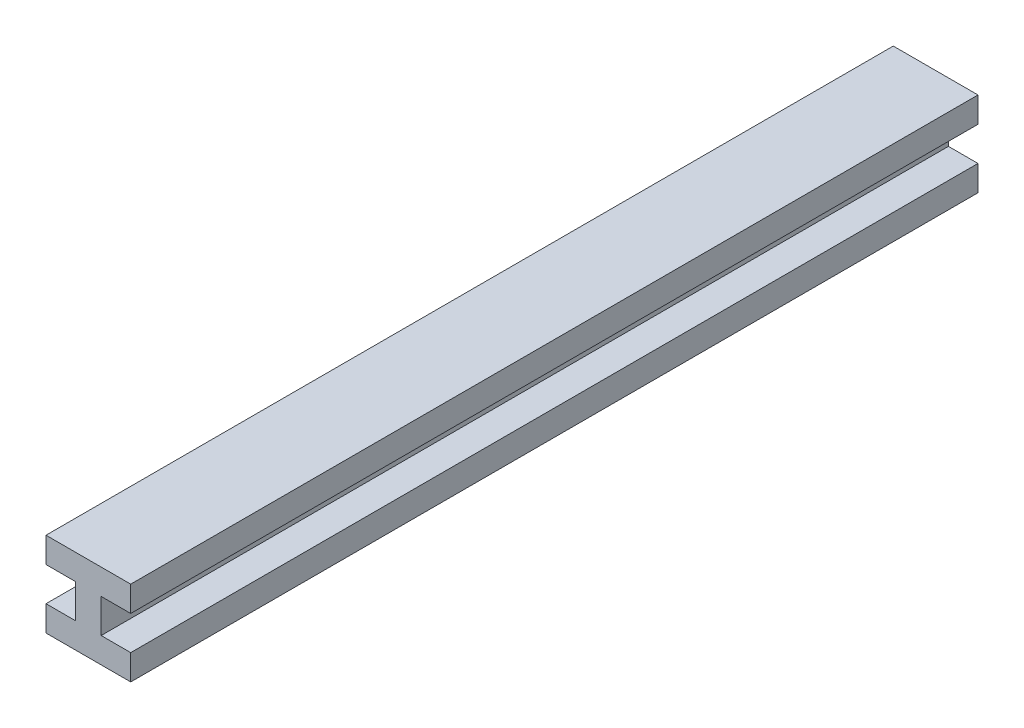
ISO-10303-21;
HEADER;
FILE_DESCRIPTION(('STEP AP214'),'2;1');
FILE_NAME('part.step','',(''),(''),'','','');
FILE_SCHEMA(('AUTOMOTIVE_DESIGN { 1 0 10303 214 1 1 1 1 }'));
ENDSEC;
DATA;
#1=APPLICATION_CONTEXT('core data for automotive mechanical design processes');
#2=APPLICATION_PROTOCOL_DEFINITION('international standard','automotive_design',2000,#1);
#3=PRODUCT_CONTEXT('',#1,'mechanical');
#4=PRODUCT('Part','Part','',(#3));
#5=PRODUCT_RELATED_PRODUCT_CATEGORY('part','',(#4));
#6=PRODUCT_DEFINITION_FORMATION('','',#4);
#7=PRODUCT_DEFINITION_CONTEXT('part definition',#1,'design');
#8=PRODUCT_DEFINITION('design','',#6,#7);
#9=PRODUCT_DEFINITION_SHAPE('','',#8);
#10=(LENGTH_UNIT() NAMED_UNIT(*) SI_UNIT(.MILLI.,.METRE.));
#11=(NAMED_UNIT(*) PLANE_ANGLE_UNIT() SI_UNIT($,.RADIAN.));
#12=(NAMED_UNIT(*) SI_UNIT($,.STERADIAN.) SOLID_ANGLE_UNIT());
#13=UNCERTAINTY_MEASURE_WITH_UNIT(LENGTH_MEASURE(1.E-05),#10,'distance_accuracy_value','');
#14=(GEOMETRIC_REPRESENTATION_CONTEXT(3) GLOBAL_UNCERTAINTY_ASSIGNED_CONTEXT((#13)) GLOBAL_UNIT_ASSIGNED_CONTEXT((#10,
#11,#12)) REPRESENTATION_CONTEXT('',''));
#15=CARTESIAN_POINT('',(0.,0.,0.));
#16=DIRECTION('',(0.,0.,1.));
#17=DIRECTION('',(1.,0.,0.));
#18=AXIS2_PLACEMENT_3D('',#15,#16,#17);
#19=CARTESIAN_POINT('',(-5.,0.,100.));
#20=DIRECTION('',(1.,0.,0.));
#21=DIRECTION('',(0.,0.,-1.));
#22=AXIS2_PLACEMENT_3D('',#19,#20,#21);
#23=PLANE('',#22);
#24=DIRECTION('',(0.,-1.,0.));
#25=VECTOR('',#24,1.);
#26=CARTESIAN_POINT('',(-5.,0.,0.));
#27=LINE('',#26,#25);
#28=CARTESIAN_POINT('',(-5.,3.,0.));
#29=VERTEX_POINT('',#28);
#30=CARTESIAN_POINT('',(-5.,0.,0.));
#31=VERTEX_POINT('',#30);
#32=EDGE_CURVE('E154',#29,#31,#27,.T.);
#33=ORIENTED_EDGE('',*,*,#32,.T.);
#34=DIRECTION('',(0.,0.,-1.));
#35=VECTOR('',#34,1.);
#36=CARTESIAN_POINT('',(-5.,0.,100.));
#37=LINE('',#36,#35);
#38=CARTESIAN_POINT('',(-5.,0.,100.));
#39=VERTEX_POINT('',#38);
#40=EDGE_CURVE('E11',#39,#31,#37,.T.);
#41=ORIENTED_EDGE('',*,*,#40,.F.);
#42=DIRECTION('',(0.,-1.,0.));
#43=VECTOR('',#42,1.);
#44=CARTESIAN_POINT('',(-5.,0.,100.));
#45=LINE('',#44,#43);
#46=CARTESIAN_POINT('',(-5.,3.,100.));
#47=VERTEX_POINT('',#46);
#48=EDGE_CURVE('E176',#47,#39,#45,.T.);
#49=ORIENTED_EDGE('',*,*,#48,.F.);
#50=DIRECTION('',(0.,0.,-1.));
#51=VECTOR('',#50,1.);
#52=CARTESIAN_POINT('',(-5.,3.,100.));
#53=LINE('',#52,#51);
#54=EDGE_CURVE('E150',#47,#29,#53,.T.);
#55=ORIENTED_EDGE('',*,*,#54,.T.);
#56=EDGE_LOOP('',(#33,#41,#49,#55));
#57=FACE_BOUND('',#56,.T.);
#58=ADVANCED_FACE('F34',(#57),#23,.F.);
#59=CARTESIAN_POINT('',(5.,0.,100.));
#60=DIRECTION('',(0.,1.,0.));
#61=DIRECTION('',(-1.,0.,0.));
#62=AXIS2_PLACEMENT_3D('',#59,#60,#61);
#63=PLANE('',#62);
#64=DIRECTION('',(1.,0.,0.));
#65=VECTOR('',#64,1.);
#66=CARTESIAN_POINT('',(5.,0.,0.));
#67=LINE('',#66,#65);
#68=CARTESIAN_POINT('',(5.,0.,0.));
#69=VERTEX_POINT('',#68);
#70=EDGE_CURVE('E157',#31,#69,#67,.T.);
#71=ORIENTED_EDGE('',*,*,#70,.T.);
#72=DIRECTION('',(0.,0.,-1.));
#73=VECTOR('',#72,1.);
#74=CARTESIAN_POINT('',(5.,0.,100.));
#75=LINE('',#74,#73);
#76=CARTESIAN_POINT('',(5.,0.,100.));
#77=VERTEX_POINT('',#76);
#78=EDGE_CURVE('E42',#77,#69,#75,.T.);
#79=ORIENTED_EDGE('',*,*,#78,.F.);
#80=DIRECTION('',(1.,0.,0.));
#81=VECTOR('',#80,1.);
#82=CARTESIAN_POINT('',(5.,0.,100.));
#83=LINE('',#82,#81);
#84=EDGE_CURVE('E105',#39,#77,#83,.T.);
#85=ORIENTED_EDGE('',*,*,#84,.F.);
#86=ORIENTED_EDGE('',*,*,#40,.T.);
#87=EDGE_LOOP('',(#71,#79,#85,#86));
#88=FACE_BOUND('',#87,.T.);
#89=ADVANCED_FACE('F254',(#88),#63,.F.);
#90=CARTESIAN_POINT('',(5.,0.,100.));
#91=DIRECTION('',(-1.,0.,0.));
#92=DIRECTION('',(0.,-1.,0.));
#93=AXIS2_PLACEMENT_3D('',#90,#91,#92);
#94=PLANE('',#93);
#95=DIRECTION('',(0.,1.,0.));
#96=VECTOR('',#95,1.);
#97=CARTESIAN_POINT('',(5.,0.,0.));
#98=LINE('',#97,#96);
#99=CARTESIAN_POINT('',(4.99999999999998,3.00000000000003,0.));
#100=VERTEX_POINT('',#99);
#101=EDGE_CURVE('E159',#69,#100,#98,.T.);
#102=ORIENTED_EDGE('',*,*,#101,.T.);
#103=DIRECTION('',(0.,0.,-1.));
#104=VECTOR('',#103,1.);
#105=CARTESIAN_POINT('',(4.99999999999998,3.00000000000003,100.));
#106=LINE('',#105,#104);
#107=CARTESIAN_POINT('',(4.99999999999998,3.00000000000003,100.));
#108=VERTEX_POINT('',#107);
#109=EDGE_CURVE('E195',#108,#100,#106,.T.);
#110=ORIENTED_EDGE('',*,*,#109,.F.);
#111=DIRECTION('',(0.,1.,0.));
#112=VECTOR('',#111,1.);
#113=CARTESIAN_POINT('',(5.,0.,100.));
#114=LINE('',#113,#112);
#115=EDGE_CURVE('E203',#77,#108,#114,.T.);
#116=ORIENTED_EDGE('',*,*,#115,.F.);
#117=ORIENTED_EDGE('',*,*,#78,.T.);
#118=EDGE_LOOP('',(#102,#110,#116,#117));
#119=FACE_BOUND('',#118,.T.);
#120=ADVANCED_FACE('F201',(#119),#94,.F.);
#121=CARTESIAN_POINT('',(4.99999999999998,3.00000000000003,100.));
#122=DIRECTION('',(0.,-1.,0.));
#123=DIRECTION('',(1.,0.,0.));
#124=AXIS2_PLACEMENT_3D('',#121,#122,#123);
#125=PLANE('',#124);
#126=DIRECTION('',(-1.,0.,0.));
#127=VECTOR('',#126,1.);
#128=CARTESIAN_POINT('',(4.99999999999998,3.00000000000003,0.));
#129=LINE('',#128,#127);
#130=CARTESIAN_POINT('',(1.51079136690661,3.,0.));
#131=VERTEX_POINT('',#130);
#132=EDGE_CURVE('E161',#100,#131,#129,.T.);
#133=ORIENTED_EDGE('',*,*,#132,.T.);
#134=DIRECTION('',(0.,0.,-1.));
#135=VECTOR('',#134,1.);
#136=CARTESIAN_POINT('',(1.51079136690661,3.,100.));
#137=LINE('',#136,#135);
#138=CARTESIAN_POINT('',(1.51079136690661,3.,100.));
#139=VERTEX_POINT('',#138);
#140=EDGE_CURVE('E192',#139,#131,#137,.T.);
#141=ORIENTED_EDGE('',*,*,#140,.F.);
#142=DIRECTION('',(-1.,0.,0.));
#143=VECTOR('',#142,1.);
#144=CARTESIAN_POINT('',(4.99999999999998,3.00000000000003,100.));
#145=LINE('',#144,#143);
#146=EDGE_CURVE('E221',#108,#139,#145,.T.);
#147=ORIENTED_EDGE('',*,*,#146,.F.);
#148=ORIENTED_EDGE('',*,*,#109,.T.);
#149=EDGE_LOOP('',(#133,#141,#147,#148));
#150=FACE_BOUND('',#149,.T.);
#151=ADVANCED_FACE('F212',(#150),#125,.F.);
#152=CARTESIAN_POINT('',(1.51079136690661,3.,100.));
#153=DIRECTION('',(-1.,0.,0.));
#154=DIRECTION('',(0.,-1.,0.));
#155=AXIS2_PLACEMENT_3D('',#152,#153,#154);
#156=PLANE('',#155);
#157=DIRECTION('',(0.,1.,0.));
#158=VECTOR('',#157,1.);
#159=CARTESIAN_POINT('',(1.51079136690661,3.,0.));
#160=LINE('',#159,#158);
#161=CARTESIAN_POINT('',(1.51079136690658,7.,0.));
#162=VERTEX_POINT('',#161);
#163=EDGE_CURVE('E163',#131,#162,#160,.T.);
#164=ORIENTED_EDGE('',*,*,#163,.T.);
#165=DIRECTION('',(0.,0.,-1.));
#166=VECTOR('',#165,1.);
#167=CARTESIAN_POINT('',(1.51079136690658,7.,100.));
#168=LINE('',#167,#166);
#169=CARTESIAN_POINT('',(1.51079136690658,7.,100.));
#170=VERTEX_POINT('',#169);
#171=EDGE_CURVE('E189',#170,#162,#168,.T.);
#172=ORIENTED_EDGE('',*,*,#171,.F.);
#173=DIRECTION('',(0.,1.,0.));
#174=VECTOR('',#173,1.);
#175=CARTESIAN_POINT('',(1.51079136690661,3.,100.));
#176=LINE('',#175,#174);
#177=EDGE_CURVE('E218',#139,#170,#176,.T.);
#178=ORIENTED_EDGE('',*,*,#177,.F.);
#179=ORIENTED_EDGE('',*,*,#140,.T.);
#180=EDGE_LOOP('',(#164,#172,#178,#179));
#181=FACE_BOUND('',#180,.T.);
#182=ADVANCED_FACE('F216',(#181),#156,.F.);
#183=CARTESIAN_POINT('',(1.51079136690658,7.,100.));
#184=DIRECTION('',(0.,1.,0.));
#185=DIRECTION('',(-1.,0.,0.));
#186=AXIS2_PLACEMENT_3D('',#183,#184,#185);
#187=PLANE('',#186);
#188=DIRECTION('',(1.,0.,0.));
#189=VECTOR('',#188,1.);
#190=CARTESIAN_POINT('',(1.51079136690658,7.,0.));
#191=LINE('',#190,#189);
#192=CARTESIAN_POINT('',(4.99999999999995,7.00000000000006,0.));
#193=VERTEX_POINT('',#192);
#194=EDGE_CURVE('E165',#162,#193,#191,.T.);
#195=ORIENTED_EDGE('',*,*,#194,.T.);
#196=DIRECTION('',(0.,0.,-1.));
#197=VECTOR('',#196,1.);
#198=CARTESIAN_POINT('',(4.99999999999995,7.00000000000006,100.));
#199=LINE('',#198,#197);
#200=CARTESIAN_POINT('',(4.99999999999995,7.00000000000006,100.));
#201=VERTEX_POINT('',#200);
#202=EDGE_CURVE('E186',#201,#193,#199,.T.);
#203=ORIENTED_EDGE('',*,*,#202,.F.);
#204=DIRECTION('',(1.,0.,0.));
#205=VECTOR('',#204,1.);
#206=CARTESIAN_POINT('',(1.51079136690658,7.,100.));
#207=LINE('',#206,#205);
#208=EDGE_CURVE('E220',#170,#201,#207,.T.);
#209=ORIENTED_EDGE('',*,*,#208,.F.);
#210=ORIENTED_EDGE('',*,*,#171,.T.);
#211=EDGE_LOOP('',(#195,#203,#209,#210));
#212=FACE_BOUND('',#211,.T.);
#213=ADVANCED_FACE('F267',(#212),#187,.F.);
#214=CARTESIAN_POINT('',(4.99999999999995,7.00000000000006,100.));
#215=DIRECTION('',(-1.,0.,0.));
#216=DIRECTION('',(0.,-1.,0.));
#217=AXIS2_PLACEMENT_3D('',#214,#215,#216);
#218=PLANE('',#217);
#219=DIRECTION('',(0.,1.,0.));
#220=VECTOR('',#219,1.);
#221=CARTESIAN_POINT('',(4.99999999999995,7.00000000000006,0.));
#222=LINE('',#221,#220);
#223=CARTESIAN_POINT('',(4.99999999999993,10.0000000000001,0.));
#224=VERTEX_POINT('',#223);
#225=EDGE_CURVE('E167',#193,#224,#222,.T.);
#226=ORIENTED_EDGE('',*,*,#225,.T.);
#227=DIRECTION('',(0.,0.,-1.));
#228=VECTOR('',#227,1.);
#229=CARTESIAN_POINT('',(4.99999999999993,10.0000000000001,100.));
#230=LINE('',#229,#228);
#231=CARTESIAN_POINT('',(4.99999999999993,10.0000000000001,100.));
#232=VERTEX_POINT('',#231);
#233=EDGE_CURVE('E183',#232,#224,#230,.T.);
#234=ORIENTED_EDGE('',*,*,#233,.F.);
#235=DIRECTION('',(0.,1.,0.));
#236=VECTOR('',#235,1.);
#237=CARTESIAN_POINT('',(4.99999999999995,7.00000000000006,100.));
#238=LINE('',#237,#236);
#239=EDGE_CURVE('E223',#201,#232,#238,.T.);
#240=ORIENTED_EDGE('',*,*,#239,.F.);
#241=ORIENTED_EDGE('',*,*,#202,.T.);
#242=EDGE_LOOP('',(#226,#234,#240,#241));
#243=FACE_BOUND('',#242,.T.);
#244=ADVANCED_FACE('F270',(#243),#218,.F.);
#245=CARTESIAN_POINT('',(-5.,10.,100.));
#246=DIRECTION('',(0.,-1.,0.));
#247=DIRECTION('',(1.,0.,0.));
#248=AXIS2_PLACEMENT_3D('',#245,#246,#247);
#249=PLANE('',#248);
#250=DIRECTION('',(-1.,0.,0.));
#251=VECTOR('',#250,1.);
#252=CARTESIAN_POINT('',(-5.,10.,0.));
#253=LINE('',#252,#251);
#254=CARTESIAN_POINT('',(-5.,10.,0.));
#255=VERTEX_POINT('',#254);
#256=EDGE_CURVE('E169',#224,#255,#253,.T.);
#257=ORIENTED_EDGE('',*,*,#256,.T.);
#258=DIRECTION('',(0.,0.,-1.));
#259=VECTOR('',#258,1.);
#260=CARTESIAN_POINT('',(-5.,10.,100.));
#261=LINE('',#260,#259);
#262=CARTESIAN_POINT('',(-5.,10.,100.));
#263=VERTEX_POINT('',#262);
#264=EDGE_CURVE('E180',#263,#255,#261,.T.);
#265=ORIENTED_EDGE('',*,*,#264,.F.);
#266=DIRECTION('',(-1.,0.,0.));
#267=VECTOR('',#266,1.);
#268=CARTESIAN_POINT('',(-5.,10.,100.));
#269=LINE('',#268,#267);
#270=EDGE_CURVE('E229',#232,#263,#269,.T.);
#271=ORIENTED_EDGE('',*,*,#270,.F.);
#272=ORIENTED_EDGE('',*,*,#233,.T.);
#273=EDGE_LOOP('',(#257,#265,#271,#272));
#274=FACE_BOUND('',#273,.T.);
#275=ADVANCED_FACE('F235',(#274),#249,.F.);
#276=CARTESIAN_POINT('',(-5.,7.,100.));
#277=DIRECTION('',(1.,0.,0.));
#278=DIRECTION('',(0.,0.,-1.));
#279=AXIS2_PLACEMENT_3D('',#276,#277,#278);
#280=PLANE('',#279);
#281=DIRECTION('',(0.,-1.,0.));
#282=VECTOR('',#281,1.);
#283=CARTESIAN_POINT('',(-5.,7.,0.));
#284=LINE('',#283,#282);
#285=CARTESIAN_POINT('',(-5.,7.,0.));
#286=VERTEX_POINT('',#285);
#287=EDGE_CURVE('E171',#255,#286,#284,.T.);
#288=ORIENTED_EDGE('',*,*,#287,.T.);
#289=DIRECTION('',(0.,0.,-1.));
#290=VECTOR('',#289,1.);
#291=CARTESIAN_POINT('',(-5.,7.,100.));
#292=LINE('',#291,#290);
#293=CARTESIAN_POINT('',(-5.,7.,100.));
#294=VERTEX_POINT('',#293);
#295=EDGE_CURVE('E145',#294,#286,#292,.T.);
#296=ORIENTED_EDGE('',*,*,#295,.F.);
#297=DIRECTION('',(0.,-1.,0.));
#298=VECTOR('',#297,1.);
#299=CARTESIAN_POINT('',(-5.,7.,100.));
#300=LINE('',#299,#298);
#301=EDGE_CURVE('E136',#263,#294,#300,.T.);
#302=ORIENTED_EDGE('',*,*,#301,.F.);
#303=ORIENTED_EDGE('',*,*,#264,.T.);
#304=EDGE_LOOP('',(#288,#296,#302,#303));
#305=FACE_BOUND('',#304,.T.);
#306=ADVANCED_FACE('F239',(#305),#280,.F.);
#307=CARTESIAN_POINT('',(-1.51079136690663,7.,100.));
#308=DIRECTION('',(0.,1.,0.));
#309=DIRECTION('',(-1.,0.,0.));
#310=AXIS2_PLACEMENT_3D('',#307,#308,#309);
#311=PLANE('',#310);
#312=DIRECTION('',(1.,0.,0.));
#313=VECTOR('',#312,1.);
#314=CARTESIAN_POINT('',(-1.51079136690663,7.,0.));
#315=LINE('',#314,#313);
#316=CARTESIAN_POINT('',(-1.51079136690663,7.,0.));
#317=VERTEX_POINT('',#316);
#318=EDGE_CURVE('E144',#286,#317,#315,.T.);
#319=ORIENTED_EDGE('',*,*,#318,.T.);
#320=DIRECTION('',(0.,0.,-1.));
#321=VECTOR('',#320,1.);
#322=CARTESIAN_POINT('',(-1.51079136690663,7.,100.));
#323=LINE('',#322,#321);
#324=CARTESIAN_POINT('',(-1.51079136690663,7.,100.));
#325=VERTEX_POINT('',#324);
#326=EDGE_CURVE('E141',#325,#317,#323,.T.);
#327=ORIENTED_EDGE('',*,*,#326,.F.);
#328=DIRECTION('',(1.,0.,0.));
#329=VECTOR('',#328,1.);
#330=CARTESIAN_POINT('',(-1.51079136690663,7.,100.));
#331=LINE('',#330,#329);
#332=EDGE_CURVE('E130',#294,#325,#331,.T.);
#333=ORIENTED_EDGE('',*,*,#332,.F.);
#334=ORIENTED_EDGE('',*,*,#295,.T.);
#335=EDGE_LOOP('',(#319,#327,#333,#334));
#336=FACE_BOUND('',#335,.T.);
#337=ADVANCED_FACE('F142',(#336),#311,.F.);
#338=CARTESIAN_POINT('',(-1.51079136690663,3.,100.));
#339=DIRECTION('',(1.,0.,0.));
#340=DIRECTION('',(0.,0.,-1.));
#341=AXIS2_PLACEMENT_3D('',#338,#339,#340);
#342=PLANE('',#341);
#343=DIRECTION('',(0.,-1.,0.));
#344=VECTOR('',#343,1.);
#345=CARTESIAN_POINT('',(-1.51079136690663,3.,0.));
#346=LINE('',#345,#344);
#347=CARTESIAN_POINT('',(-1.51079136690663,3.,0.));
#348=VERTEX_POINT('',#347);
#349=EDGE_CURVE('E91',#317,#348,#346,.T.);
#350=ORIENTED_EDGE('',*,*,#349,.T.);
#351=DIRECTION('',(0.,0.,-1.));
#352=VECTOR('',#351,1.);
#353=CARTESIAN_POINT('',(-1.51079136690663,3.,100.));
#354=LINE('',#353,#352);
#355=CARTESIAN_POINT('',(-1.51079136690663,3.,100.));
#356=VERTEX_POINT('',#355);
#357=EDGE_CURVE('E146',#356,#348,#354,.T.);
#358=ORIENTED_EDGE('',*,*,#357,.F.);
#359=DIRECTION('',(0.,-1.,0.));
#360=VECTOR('',#359,1.);
#361=CARTESIAN_POINT('',(-1.51079136690663,3.,100.));
#362=LINE('',#361,#360);
#363=EDGE_CURVE('E134',#325,#356,#362,.T.);
#364=ORIENTED_EDGE('',*,*,#363,.F.);
#365=ORIENTED_EDGE('',*,*,#326,.T.);
#366=EDGE_LOOP('',(#350,#358,#364,#365));
#367=FACE_BOUND('',#366,.T.);
#368=ADVANCED_FACE('F148',(#367),#342,.F.);
#369=CARTESIAN_POINT('',(-5.,3.,100.));
#370=DIRECTION('',(0.,-1.,0.));
#371=DIRECTION('',(0.,0.,-1.));
#372=AXIS2_PLACEMENT_3D('',#369,#370,#371);
#373=PLANE('',#372);
#374=DIRECTION('',(-1.,0.,0.));
#375=VECTOR('',#374,1.);
#376=CARTESIAN_POINT('',(-5.,3.,0.));
#377=LINE('',#376,#375);
#378=EDGE_CURVE('E97',#348,#29,#377,.T.);
#379=ORIENTED_EDGE('',*,*,#378,.T.);
#380=ORIENTED_EDGE('',*,*,#54,.F.);
#381=DIRECTION('',(-1.,0.,0.));
#382=VECTOR('',#381,1.);
#383=CARTESIAN_POINT('',(-5.,3.,100.));
#384=LINE('',#383,#382);
#385=EDGE_CURVE('E50',#356,#47,#384,.T.);
#386=ORIENTED_EDGE('',*,*,#385,.F.);
#387=ORIENTED_EDGE('',*,*,#357,.T.);
#388=EDGE_LOOP('',(#379,#380,#386,#387));
#389=FACE_BOUND('',#388,.T.);
#390=ADVANCED_FACE('F243',(#389),#373,.F.);
#391=CARTESIAN_POINT('',(0.,0.,100.));
#392=DIRECTION('',(0.,0.,-1.));
#393=DIRECTION('',(-1.,0.,0.));
#394=AXIS2_PLACEMENT_3D('',#391,#392,#393);
#395=PLANE('',#394);
#396=ORIENTED_EDGE('',*,*,#48,.T.);
#397=ORIENTED_EDGE('',*,*,#84,.T.);
#398=ORIENTED_EDGE('',*,*,#115,.T.);
#399=ORIENTED_EDGE('',*,*,#146,.T.);
#400=ORIENTED_EDGE('',*,*,#177,.T.);
#401=ORIENTED_EDGE('',*,*,#208,.T.);
#402=ORIENTED_EDGE('',*,*,#239,.T.);
#403=ORIENTED_EDGE('',*,*,#270,.T.);
#404=ORIENTED_EDGE('',*,*,#301,.T.);
#405=ORIENTED_EDGE('',*,*,#332,.T.);
#406=ORIENTED_EDGE('',*,*,#363,.T.);
#407=ORIENTED_EDGE('',*,*,#385,.T.);
#408=EDGE_LOOP('',(#396,#397,#398,#399,#400,#401,#402,#403,#404,#405,#406,#407));
#409=FACE_BOUND('',#408,.T.);
#410=ADVANCED_FACE('F132',(#409),#395,.F.);
#411=CARTESIAN_POINT('',(0.,0.,0.));
#412=DIRECTION('',(0.,0.,-1.));
#413=DIRECTION('',(-1.,0.,0.));
#414=AXIS2_PLACEMENT_3D('',#411,#412,#413);
#415=PLANE('',#414);
#416=ORIENTED_EDGE('',*,*,#32,.F.);
#417=ORIENTED_EDGE('',*,*,#378,.F.);
#418=ORIENTED_EDGE('',*,*,#349,.F.);
#419=ORIENTED_EDGE('',*,*,#318,.F.);
#420=ORIENTED_EDGE('',*,*,#287,.F.);
#421=ORIENTED_EDGE('',*,*,#256,.F.);
#422=ORIENTED_EDGE('',*,*,#225,.F.);
#423=ORIENTED_EDGE('',*,*,#194,.F.);
#424=ORIENTED_EDGE('',*,*,#163,.F.);
#425=ORIENTED_EDGE('',*,*,#132,.F.);
#426=ORIENTED_EDGE('',*,*,#101,.F.);
#427=ORIENTED_EDGE('',*,*,#70,.F.);
#428=EDGE_LOOP('',(#416,#417,#418,#419,#420,#421,#422,#423,#424,#425,#426,#427));
#429=FACE_BOUND('',#428,.T.);
#430=ADVANCED_FACE('F207',(#429),#415,.T.);
#431=CLOSED_SHELL('',(#58,#89,#120,#151,#182,#213,#244,#275,#306,#337,#368,#390,#410,#430));
#432=MANIFOLD_SOLID_BREP('B2',#431);
#433=ADVANCED_BREP_SHAPE_REPRESENTATION('',(#18,#432),#14);
#434=SHAPE_DEFINITION_REPRESENTATION(#9,#433);
ENDSEC;
END-ISO-10303-21;
